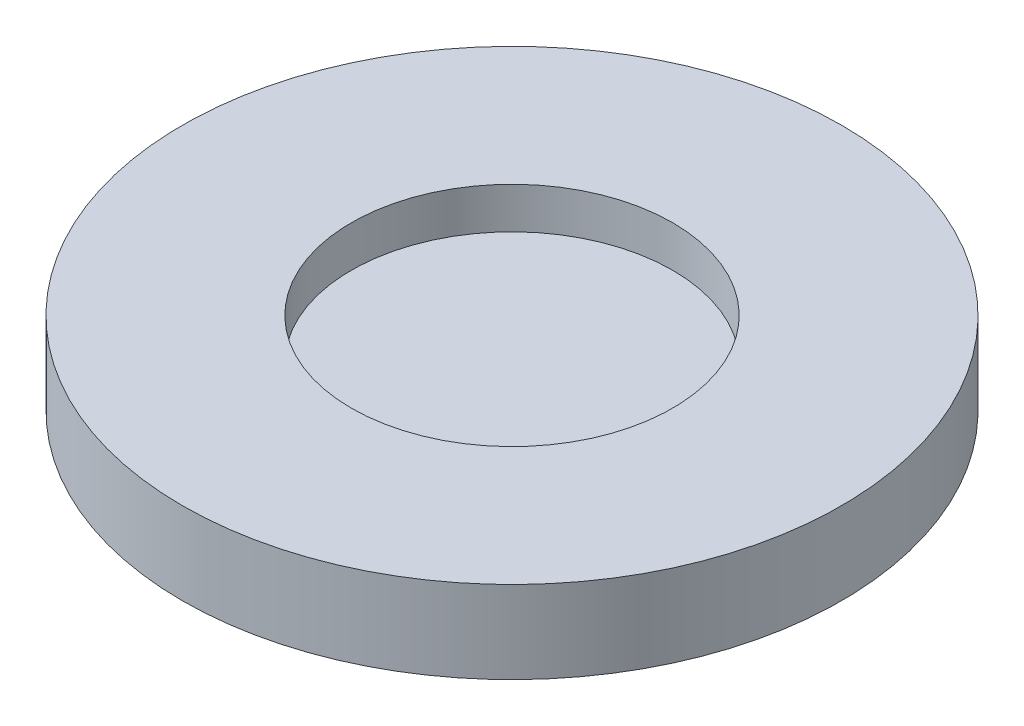
ISO-10303-21;
HEADER;
FILE_DESCRIPTION(('STEP AP214'),'2;1');
FILE_NAME('part.step','',(''),(''),'','','');
FILE_SCHEMA(('AUTOMOTIVE_DESIGN { 1 0 10303 214 1 1 1 1 }'));
ENDSEC;
DATA;
#1=APPLICATION_CONTEXT('core data for automotive mechanical design processes');
#2=APPLICATION_PROTOCOL_DEFINITION('international standard','automotive_design',2000,#1);
#3=PRODUCT_CONTEXT('',#1,'mechanical');
#4=PRODUCT('Part','Part','',(#3));
#5=PRODUCT_RELATED_PRODUCT_CATEGORY('part','',(#4));
#6=PRODUCT_DEFINITION_FORMATION('','',#4);
#7=PRODUCT_DEFINITION_CONTEXT('part definition',#1,'design');
#8=PRODUCT_DEFINITION('design','',#6,#7);
#9=PRODUCT_DEFINITION_SHAPE('','',#8);
#10=(LENGTH_UNIT() NAMED_UNIT(*) SI_UNIT(.MILLI.,.METRE.));
#11=(NAMED_UNIT(*) PLANE_ANGLE_UNIT() SI_UNIT($,.RADIAN.));
#12=(NAMED_UNIT(*) SI_UNIT($,.STERADIAN.) SOLID_ANGLE_UNIT());
#13=UNCERTAINTY_MEASURE_WITH_UNIT(LENGTH_MEASURE(1.E-05),#10,'distance_accuracy_value','');
#14=(GEOMETRIC_REPRESENTATION_CONTEXT(3) GLOBAL_UNCERTAINTY_ASSIGNED_CONTEXT((#13)) GLOBAL_UNIT_ASSIGNED_CONTEXT((#10,
#11,#12)) REPRESENTATION_CONTEXT('',''));
#15=CARTESIAN_POINT('',(0.,0.,0.));
#16=DIRECTION('',(0.,0.,1.));
#17=DIRECTION('',(1.,0.,0.));
#18=AXIS2_PLACEMENT_3D('',#15,#16,#17);
#19=CARTESIAN_POINT('',(0.,10.,0.));
#20=DIRECTION('',(0.,-1.,0.));
#21=DIRECTION('',(0.,0.,-1.));
#22=AXIS2_PLACEMENT_3D('',#19,#20,#21);
#23=CYLINDRICAL_SURFACE('',#22,40.);
#24=CARTESIAN_POINT('',(0.,10.,0.));
#25=DIRECTION('',(0.,1.,0.));
#26=DIRECTION('',(0.,0.,1.));
#27=AXIS2_PLACEMENT_3D('',#24,#25,#26);
#28=CIRCLE('',#27,40.);
#29=CARTESIAN_POINT('',(0.,10.,40.));
#30=VERTEX_POINT('',#29);
#31=EDGE_CURVE('E10',#30,#30,#28,.T.);
#32=ORIENTED_EDGE('',*,*,#31,.F.);
#33=EDGE_LOOP('',(#32));
#34=FACE_BOUND('',#33,.T.);
#35=CARTESIAN_POINT('',(0.,0.,0.));
#36=DIRECTION('',(0.,1.,0.));
#37=DIRECTION('',(0.,0.,1.));
#38=AXIS2_PLACEMENT_3D('',#35,#36,#37);
#39=CIRCLE('',#38,40.);
#40=CARTESIAN_POINT('',(0.,0.,40.));
#41=VERTEX_POINT('',#40);
#42=EDGE_CURVE('E40',#41,#41,#39,.T.);
#43=ORIENTED_EDGE('',*,*,#42,.T.);
#44=EDGE_LOOP('',(#43));
#45=FACE_BOUND('',#44,.T.);
#46=ADVANCED_FACE('F37',(#34,#45),#23,.T.);
#47=CARTESIAN_POINT('',(0.,10.,0.));
#48=DIRECTION('',(0.,1.,0.));
#49=DIRECTION('',(0.,0.,1.));
#50=AXIS2_PLACEMENT_3D('',#47,#48,#49);
#51=PLANE('',#50);
#52=CARTESIAN_POINT('',(0.,10.,0.));
#53=DIRECTION('',(0.,1.,0.));
#54=DIRECTION('',(0.,0.,1.));
#55=AXIS2_PLACEMENT_3D('',#52,#53,#54);
#56=CIRCLE('',#55,19.5);
#57=CARTESIAN_POINT('',(0.,10.,19.5));
#58=VERTEX_POINT('',#57);
#59=EDGE_CURVE('E51',#58,#58,#56,.T.);
#60=ORIENTED_EDGE('',*,*,#59,.F.);
#61=EDGE_LOOP('',(#60));
#62=FACE_BOUND('',#61,.T.);
#63=ORIENTED_EDGE('',*,*,#31,.T.);
#64=EDGE_LOOP('',(#63));
#65=FACE_BOUND('',#64,.T.);
#66=ADVANCED_FACE('F68',(#62,#65),#51,.T.);
#67=CARTESIAN_POINT('',(0.,0.,0.));
#68=DIRECTION('',(0.,1.,0.));
#69=DIRECTION('',(0.,0.,1.));
#70=AXIS2_PLACEMENT_3D('',#67,#68,#69);
#71=PLANE('',#70);
#72=ORIENTED_EDGE('',*,*,#42,.F.);
#73=EDGE_LOOP('',(#72));
#74=FACE_BOUND('',#73,.T.);
#75=ADVANCED_FACE('F64',(#74),#71,.F.);
#76=CARTESIAN_POINT('',(0.,5.,0.));
#77=DIRECTION('',(0.,1.,0.));
#78=DIRECTION('',(0.,0.,1.));
#79=AXIS2_PLACEMENT_3D('',#76,#77,#78);
#80=CYLINDRICAL_SURFACE('',#79,19.5);
#81=CARTESIAN_POINT('',(0.,5.,0.));
#82=DIRECTION('',(0.,1.,0.));
#83=DIRECTION('',(0.,0.,1.));
#84=AXIS2_PLACEMENT_3D('',#81,#82,#83);
#85=CIRCLE('',#84,19.5);
#86=CARTESIAN_POINT('',(0.,5.,19.5));
#87=VERTEX_POINT('',#86);
#88=EDGE_CURVE('E49',#87,#87,#85,.T.);
#89=ORIENTED_EDGE('',*,*,#88,.F.);
#90=EDGE_LOOP('',(#89));
#91=FACE_BOUND('',#90,.T.);
#92=ORIENTED_EDGE('',*,*,#59,.T.);
#93=EDGE_LOOP('',(#92));
#94=FACE_BOUND('',#93,.T.);
#95=ADVANCED_FACE('F61',(#91,#94),#80,.F.);
#96=CARTESIAN_POINT('',(0.,5.,0.));
#97=DIRECTION('',(0.,1.,0.));
#98=DIRECTION('',(0.,0.,1.));
#99=AXIS2_PLACEMENT_3D('',#96,#97,#98);
#100=PLANE('',#99);
#101=ORIENTED_EDGE('',*,*,#88,.T.);
#102=EDGE_LOOP('',(#101));
#103=FACE_BOUND('',#102,.T.);
#104=ADVANCED_FACE('F59',(#103),#100,.T.);
#105=CLOSED_SHELL('',(#46,#66,#75,#95,#104));
#106=MANIFOLD_SOLID_BREP('B2',#105);
#107=ADVANCED_BREP_SHAPE_REPRESENTATION('',(#18,#106),#14);
#108=SHAPE_DEFINITION_REPRESENTATION(#9,#107);
ENDSEC;
END-ISO-10303-21;
